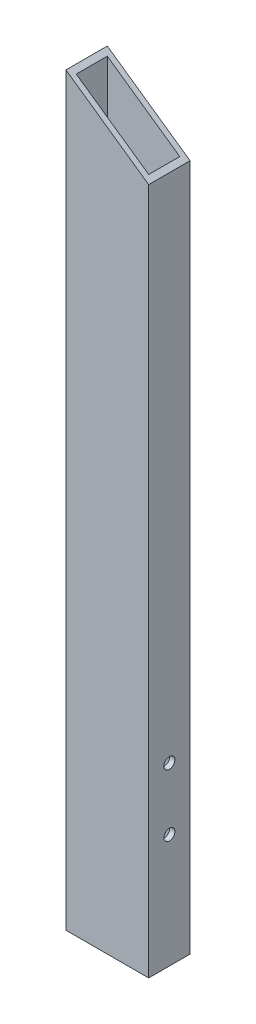
ISO-10303-21;
HEADER;
FILE_DESCRIPTION(('STEP AP214'),'2;1');
FILE_NAME('part.step','',(''),(''),'','','');
FILE_SCHEMA(('AUTOMOTIVE_DESIGN { 1 0 10303 214 1 1 1 1 }'));
ENDSEC;
DATA;
#1=APPLICATION_CONTEXT('core data for automotive mechanical design processes');
#2=APPLICATION_PROTOCOL_DEFINITION('international standard','automotive_design',2000,#1);
#3=PRODUCT_CONTEXT('',#1,'mechanical');
#4=PRODUCT('Part','Part','',(#3));
#5=PRODUCT_RELATED_PRODUCT_CATEGORY('part','',(#4));
#6=PRODUCT_DEFINITION_FORMATION('','',#4);
#7=PRODUCT_DEFINITION_CONTEXT('part definition',#1,'design');
#8=PRODUCT_DEFINITION('design','',#6,#7);
#9=PRODUCT_DEFINITION_SHAPE('','',#8);
#10=(LENGTH_UNIT() NAMED_UNIT(*) SI_UNIT(.MILLI.,.METRE.));
#11=(NAMED_UNIT(*) PLANE_ANGLE_UNIT() SI_UNIT($,.RADIAN.));
#12=(NAMED_UNIT(*) SI_UNIT($,.STERADIAN.) SOLID_ANGLE_UNIT());
#13=UNCERTAINTY_MEASURE_WITH_UNIT(LENGTH_MEASURE(1.E-05),#10,'distance_accuracy_value','');
#14=(GEOMETRIC_REPRESENTATION_CONTEXT(3) GLOBAL_UNCERTAINTY_ASSIGNED_CONTEXT((#13)) GLOBAL_UNIT_ASSIGNED_CONTEXT((#10,
#11,#12)) REPRESENTATION_CONTEXT('',''));
#15=CARTESIAN_POINT('',(0.,0.,0.));
#16=DIRECTION('',(0.,0.,1.));
#17=DIRECTION('',(1.,0.,0.));
#18=AXIS2_PLACEMENT_3D('',#15,#16,#17);
#19=CARTESIAN_POINT('',(476.298045993007,69.85,-8.9078572836938));
#20=DIRECTION('',(-1.,0.,0.));
#21=DIRECTION('',(0.,1.,0.));
#22=AXIS2_PLACEMENT_3D('',#19,#20,#21);
#23=CYLINDRICAL_SURFACE('',#22,3.3782);
#24=CARTESIAN_POINT('',(18.7587744536942,69.85,-8.90785728369348));
#25=DIRECTION('',(-1.,0.,0.));
#26=DIRECTION('',(0.,1.,0.));
#27=AXIS2_PLACEMENT_3D('',#24,#25,#26);
#28=CIRCLE('',#27,3.3782);
#29=CARTESIAN_POINT('',(18.7587744536942,73.2282,-8.90785728369348));
#30=VERTEX_POINT('',#29);
#31=EDGE_CURVE('E210',#30,#30,#28,.T.);
#32=ORIENTED_EDGE('',*,*,#31,.F.);
#33=EDGE_LOOP('',(#32));
#34=FACE_BOUND('',#33,.T.);
#35=CARTESIAN_POINT('',(15.5837744536942,69.85,-8.90785728369348));
#36=DIRECTION('',(1.,0.,0.));
#37=DIRECTION('',(0.,1.,0.));
#38=AXIS2_PLACEMENT_3D('',#35,#36,#37);
#39=CIRCLE('',#38,3.3782);
#40=CARTESIAN_POINT('',(15.5837744536942,73.2282,-8.90785728369348));
#41=VERTEX_POINT('',#40);
#42=EDGE_CURVE('E26',#41,#41,#39,.T.);
#43=ORIENTED_EDGE('',*,*,#42,.F.);
#44=EDGE_LOOP('',(#43));
#45=FACE_BOUND('',#44,.T.);
#46=ADVANCED_FACE('F16',(#34,#45),#23,.F.);
#47=CARTESIAN_POINT('',(476.298045993007,107.95,-8.9078572836938));
#48=DIRECTION('',(-1.,0.,0.));
#49=DIRECTION('',(0.,1.,0.));
#50=AXIS2_PLACEMENT_3D('',#47,#48,#49);
#51=CYLINDRICAL_SURFACE('',#50,3.3782);
#52=CARTESIAN_POINT('',(18.7587744536942,107.95,-8.90785728369348));
#53=DIRECTION('',(-1.,0.,0.));
#54=DIRECTION('',(0.,1.,0.));
#55=AXIS2_PLACEMENT_3D('',#52,#53,#54);
#56=CIRCLE('',#55,3.3782);
#57=CARTESIAN_POINT('',(18.7587744536942,111.3282,-8.90785728369348));
#58=VERTEX_POINT('',#57);
#59=EDGE_CURVE('E153',#58,#58,#56,.T.);
#60=ORIENTED_EDGE('',*,*,#59,.F.);
#61=EDGE_LOOP('',(#60));
#62=FACE_BOUND('',#61,.T.);
#63=CARTESIAN_POINT('',(15.5837744536942,107.95,-8.90785728369348));
#64=DIRECTION('',(1.,0.,0.));
#65=DIRECTION('',(0.,1.,0.));
#66=AXIS2_PLACEMENT_3D('',#63,#64,#65);
#67=CIRCLE('',#66,3.3782);
#68=CARTESIAN_POINT('',(15.5837744536942,111.3282,-8.90785728369348));
#69=VERTEX_POINT('',#68);
#70=EDGE_CURVE('E220',#69,#69,#67,.T.);
#71=ORIENTED_EDGE('',*,*,#70,.F.);
#72=EDGE_LOOP('',(#71));
#73=FACE_BOUND('',#72,.T.);
#74=ADVANCED_FACE('F178',(#62,#73),#51,.F.);
#75=CARTESIAN_POINT('',(428.673045993007,69.85,-8.90785728369361));
#76=DIRECTION('',(-1.,0.,0.));
#77=DIRECTION('',(0.,1.,0.));
#78=AXIS2_PLACEMENT_3D('',#75,#76,#77);
#79=CYLINDRICAL_SURFACE('',#78,3.3782);
#80=CARTESIAN_POINT('',(-28.8662255463058,69.85,-8.90785728369345));
#81=DIRECTION('',(-1.,0.,0.));
#82=DIRECTION('',(0.,1.,0.));
#83=AXIS2_PLACEMENT_3D('',#80,#81,#82);
#84=CIRCLE('',#83,3.3782);
#85=CARTESIAN_POINT('',(-28.8662255463058,73.2282,-8.90785728369345));
#86=VERTEX_POINT('',#85);
#87=EDGE_CURVE('E161',#86,#86,#84,.T.);
#88=ORIENTED_EDGE('',*,*,#87,.F.);
#89=EDGE_LOOP('',(#88));
#90=FACE_BOUND('',#89,.T.);
#91=CARTESIAN_POINT('',(-32.0412255463059,69.85,-8.90785728369344));
#92=DIRECTION('',(1.,0.,0.));
#93=DIRECTION('',(0.,1.,0.));
#94=AXIS2_PLACEMENT_3D('',#91,#92,#93);
#95=CIRCLE('',#94,3.3782);
#96=CARTESIAN_POINT('',(-32.0412255463059,73.2282,-8.90785728369344));
#97=VERTEX_POINT('',#96);
#98=EDGE_CURVE('E122',#97,#97,#95,.T.);
#99=ORIENTED_EDGE('',*,*,#98,.F.);
#100=EDGE_LOOP('',(#99));
#101=FACE_BOUND('',#100,.T.);
#102=ADVANCED_FACE('F184',(#90,#101),#79,.F.);
#103=CARTESIAN_POINT('',(428.673045993007,107.95,-8.90785728369361));
#104=DIRECTION('',(-1.,0.,0.));
#105=DIRECTION('',(0.,1.,0.));
#106=AXIS2_PLACEMENT_3D('',#103,#104,#105);
#107=CYLINDRICAL_SURFACE('',#106,3.3782);
#108=CARTESIAN_POINT('',(-28.8662255463058,107.95,-8.90785728369345));
#109=DIRECTION('',(-1.,0.,0.));
#110=DIRECTION('',(0.,1.,0.));
#111=AXIS2_PLACEMENT_3D('',#108,#109,#110);
#112=CIRCLE('',#111,3.3782);
#113=CARTESIAN_POINT('',(-28.8662255463058,111.3282,-8.90785728369345));
#114=VERTEX_POINT('',#113);
#115=EDGE_CURVE('E141',#114,#114,#112,.T.);
#116=ORIENTED_EDGE('',*,*,#115,.F.);
#117=EDGE_LOOP('',(#116));
#118=FACE_BOUND('',#117,.T.);
#119=CARTESIAN_POINT('',(-32.0412255463059,107.95,-8.90785728369344));
#120=DIRECTION('',(1.,0.,0.));
#121=DIRECTION('',(0.,1.,0.));
#122=AXIS2_PLACEMENT_3D('',#119,#120,#121);
#123=CIRCLE('',#122,3.3782);
#124=CARTESIAN_POINT('',(-32.0412255463059,111.3282,-8.90785728369344));
#125=VERTEX_POINT('',#124);
#126=EDGE_CURVE('E115',#125,#125,#123,.T.);
#127=ORIENTED_EDGE('',*,*,#126,.F.);
#128=EDGE_LOOP('',(#127));
#129=FACE_BOUND('',#128,.T.);
#130=ADVANCED_FACE('F192',(#118,#129),#107,.F.);
#131=CARTESIAN_POINT('',(18.7587744536942,421.629457058947,3.79214271630647));
#132=DIRECTION('',(-0.573576436351046,-0.819152044288992,0.));
#133=DIRECTION('',(0.819152044288992,-0.573576436351046,0.));
#134=AXIS2_PLACEMENT_3D('',#131,#132,#133);
#135=PLANE('',#134);
#136=DIRECTION('',(0.,0.,1.));
#137=VECTOR('',#136,1.);
#138=CARTESIAN_POINT('',(-28.8662255463058,454.976841066184,-7.32035728369349));
#139=LINE('',#138,#137);
#140=CARTESIAN_POINT('',(-28.8662255463058,454.976841066184,-18.4328572836935));
#141=VERTEX_POINT('',#140);
#142=CARTESIAN_POINT('',(-28.8662255463058,454.976841066184,0.617142716306469));
#143=VERTEX_POINT('',#142);
#144=EDGE_CURVE('E35',#141,#143,#139,.T.);
#145=ORIENTED_EDGE('',*,*,#144,.F.);
#146=DIRECTION('',(-0.819152044288992,0.573576436351046,0.));
#147=VECTOR('',#146,1.);
#148=CARTESIAN_POINT('',(116.744068340995,353.019415645365,-18.4328572836936));
#149=LINE('',#148,#147);
#150=CARTESIAN_POINT('',(15.5837744536942,423.852615992763,-18.4328572836935));
#151=VERTEX_POINT('',#150);
#152=EDGE_CURVE('E136',#151,#141,#149,.T.);
#153=ORIENTED_EDGE('',*,*,#152,.F.);
#154=DIRECTION('',(0.,0.,-1.));
#155=VECTOR('',#154,1.);
#156=CARTESIAN_POINT('',(15.5837744536942,423.852615992763,2.20464271630657));
#157=LINE('',#156,#155);
#158=CARTESIAN_POINT('',(15.5837744536942,423.852615992763,0.617142716306464));
#159=VERTEX_POINT('',#158);
#160=EDGE_CURVE('E135',#159,#151,#157,.T.);
#161=ORIENTED_EDGE('',*,*,#160,.F.);
#162=DIRECTION('',(0.819152044288992,-0.573576436351046,0.));
#163=VECTOR('',#162,1.);
#164=CARTESIAN_POINT('',(101.830869498288,363.461749893849,0.617142716306453));
#165=LINE('',#164,#163);
#166=EDGE_CURVE('E121',#143,#159,#165,.T.);
#167=ORIENTED_EDGE('',*,*,#166,.F.);
#168=EDGE_LOOP('',(#145,#153,#161,#167));
#169=FACE_BOUND('',#168,.T.);
#170=DIRECTION('',(-0.819152044288992,0.573576436351046,0.));
#171=VECTOR('',#170,1.);
#172=CARTESIAN_POINT('',(100.765641009523,364.207630911598,3.79214271630647));
#173=LINE('',#172,#171);
#174=CARTESIAN_POINT('',(18.7587744536942,421.629457058947,3.79214271630647));
#175=VERTEX_POINT('',#174);
#176=CARTESIAN_POINT('',(-32.0412255463058,457.2,3.79214271630647));
#177=VERTEX_POINT('',#176);
#178=EDGE_CURVE('E112',#175,#177,#173,.T.);
#179=ORIENTED_EDGE('',*,*,#178,.F.);
#180=DIRECTION('',(0.,0.,1.));
#181=VECTOR('',#180,1.);
#182=CARTESIAN_POINT('',(18.7587744536942,421.629457058947,3.79214271630653));
#183=LINE('',#182,#181);
#184=CARTESIAN_POINT('',(18.7587744536942,421.629457058947,-21.6078572836935));
#185=VERTEX_POINT('',#184);
#186=EDGE_CURVE('E111',#185,#175,#183,.T.);
#187=ORIENTED_EDGE('',*,*,#186,.F.);
#188=DIRECTION('',(0.819152044288992,-0.573576436351046,0.));
#189=VECTOR('',#188,1.);
#190=CARTESIAN_POINT('',(117.809296829759,352.273534627617,-21.6078572836935));
#191=LINE('',#190,#189);
#192=CARTESIAN_POINT('',(-32.0412255463058,457.2,-21.6078572836935));
#193=VERTEX_POINT('',#192);
#194=EDGE_CURVE('E98',#193,#185,#191,.T.);
#195=ORIENTED_EDGE('',*,*,#194,.F.);
#196=DIRECTION('',(0.,0.,1.));
#197=VECTOR('',#196,1.);
#198=CARTESIAN_POINT('',(-32.0412255463058,457.2,3.79214271630647));
#199=LINE('',#198,#197);
#200=EDGE_CURVE('E11',#193,#177,#199,.T.);
#201=ORIENTED_EDGE('',*,*,#200,.T.);
#202=EDGE_LOOP('',(#179,#187,#195,#201));
#203=FACE_BOUND('',#202,.T.);
#204=ADVANCED_FACE('F156',(#169,#203),#135,.F.);
#205=CARTESIAN_POINT('',(15.5837744536942,0.,0.617142716306464));
#206=DIRECTION('',(1.,0.,0.));
#207=DIRECTION('',(0.,0.,-1.));
#208=AXIS2_PLACEMENT_3D('',#205,#206,#207);
#209=PLANE('',#208);
#210=ORIENTED_EDGE('',*,*,#42,.T.);
#211=EDGE_LOOP('',(#210));
#212=FACE_BOUND('',#211,.T.);
#213=ORIENTED_EDGE('',*,*,#70,.T.);
#214=EDGE_LOOP('',(#213));
#215=FACE_BOUND('',#214,.T.);
#216=ORIENTED_EDGE('',*,*,#160,.T.);
#217=DIRECTION('',(0.,1.,0.));
#218=VECTOR('',#217,1.);
#219=CARTESIAN_POINT('',(15.5837744536942,0.,-18.4328572836935));
#220=LINE('',#219,#218);
#221=CARTESIAN_POINT('',(15.5837744536942,0.,-18.4328572836935));
#222=VERTEX_POINT('',#221);
#223=EDGE_CURVE('E131',#222,#151,#220,.T.);
#224=ORIENTED_EDGE('',*,*,#223,.F.);
#225=DIRECTION('',(0.,0.,-1.));
#226=VECTOR('',#225,1.);
#227=CARTESIAN_POINT('',(15.5837744536942,0.,-4.14535728369355));
#228=LINE('',#227,#226);
#229=CARTESIAN_POINT('',(15.5837744536942,0.,0.617142716306464));
#230=VERTEX_POINT('',#229);
#231=EDGE_CURVE('E125',#230,#222,#228,.T.);
#232=ORIENTED_EDGE('',*,*,#231,.F.);
#233=DIRECTION('',(0.,1.,0.));
#234=VECTOR('',#233,1.);
#235=CARTESIAN_POINT('',(15.5837744536942,0.,0.617142716306464));
#236=LINE('',#235,#234);
#237=EDGE_CURVE('E132',#230,#159,#236,.T.);
#238=ORIENTED_EDGE('',*,*,#237,.T.);
#239=EDGE_LOOP('',(#216,#224,#232,#238));
#240=FACE_BOUND('',#239,.T.);
#241=ADVANCED_FACE('F199',(#212,#215,#240),#209,.F.);
#242=CARTESIAN_POINT('',(15.5837744536942,0.,-18.4328572836935));
#243=DIRECTION('',(0.,0.,-1.));
#244=DIRECTION('',(-1.,0.,0.));
#245=AXIS2_PLACEMENT_3D('',#242,#243,#244);
#246=PLANE('',#245);
#247=ORIENTED_EDGE('',*,*,#152,.T.);
#248=DIRECTION('',(0.,1.,0.));
#249=VECTOR('',#248,1.);
#250=CARTESIAN_POINT('',(-28.8662255463058,0.,-18.4328572836935));
#251=LINE('',#250,#249);
#252=CARTESIAN_POINT('',(-28.8662255463058,0.,-18.4328572836935));
#253=VERTEX_POINT('',#252);
#254=EDGE_CURVE('E137',#253,#141,#251,.T.);
#255=ORIENTED_EDGE('',*,*,#254,.F.);
#256=DIRECTION('',(-1.,0.,0.));
#257=VECTOR('',#256,1.);
#258=CARTESIAN_POINT('',(4.47127445369416,0.,-18.4328572836935));
#259=LINE('',#258,#257);
#260=EDGE_CURVE('E117',#222,#253,#259,.T.);
#261=ORIENTED_EDGE('',*,*,#260,.F.);
#262=ORIENTED_EDGE('',*,*,#223,.T.);
#263=EDGE_LOOP('',(#247,#255,#261,#262));
#264=FACE_BOUND('',#263,.T.);
#265=ADVANCED_FACE('F174',(#264),#246,.F.);
#266=CARTESIAN_POINT('',(18.7587744536942,0.,3.79214271630647));
#267=DIRECTION('',(1.,0.,0.));
#268=DIRECTION('',(0.,0.,-1.));
#269=AXIS2_PLACEMENT_3D('',#266,#267,#268);
#270=PLANE('',#269);
#271=ORIENTED_EDGE('',*,*,#31,.T.);
#272=EDGE_LOOP('',(#271));
#273=FACE_BOUND('',#272,.T.);
#274=ORIENTED_EDGE('',*,*,#59,.T.);
#275=EDGE_LOOP('',(#274));
#276=FACE_BOUND('',#275,.T.);
#277=ORIENTED_EDGE('',*,*,#186,.T.);
#278=DIRECTION('',(0.,1.,0.));
#279=VECTOR('',#278,1.);
#280=CARTESIAN_POINT('',(18.7587744536942,0.,3.79214271630647));
#281=LINE('',#280,#279);
#282=CARTESIAN_POINT('',(18.7587744536942,0.,3.79214271630647));
#283=VERTEX_POINT('',#282);
#284=EDGE_CURVE('E108',#283,#175,#281,.T.);
#285=ORIENTED_EDGE('',*,*,#284,.F.);
#286=DIRECTION('',(0.,0.,1.));
#287=VECTOR('',#286,1.);
#288=CARTESIAN_POINT('',(18.7587744536942,0.,-21.6078572836935));
#289=LINE('',#288,#287);
#290=CARTESIAN_POINT('',(18.7587744536942,0.,-21.6078572836935));
#291=VERTEX_POINT('',#290);
#292=EDGE_CURVE('E103',#291,#283,#289,.T.);
#293=ORIENTED_EDGE('',*,*,#292,.F.);
#294=DIRECTION('',(0.,1.,0.));
#295=VECTOR('',#294,1.);
#296=CARTESIAN_POINT('',(18.7587744536942,0.,-21.6078572836935));
#297=LINE('',#296,#295);
#298=EDGE_CURVE('E102',#291,#185,#297,.T.);
#299=ORIENTED_EDGE('',*,*,#298,.T.);
#300=EDGE_LOOP('',(#277,#285,#293,#299));
#301=FACE_BOUND('',#300,.T.);
#302=ADVANCED_FACE('F159',(#273,#276,#301),#270,.T.);
#303=CARTESIAN_POINT('',(-32.0412255463058,0.,3.79214271630647));
#304=DIRECTION('',(0.,0.,1.));
#305=DIRECTION('',(1.,0.,0.));
#306=AXIS2_PLACEMENT_3D('',#303,#304,#305);
#307=PLANE('',#306);
#308=ORIENTED_EDGE('',*,*,#178,.T.);
#309=DIRECTION('',(0.,1.,0.));
#310=VECTOR('',#309,1.);
#311=CARTESIAN_POINT('',(-32.0412255463058,0.,3.79214271630647));
#312=LINE('',#311,#310);
#313=CARTESIAN_POINT('',(-32.0412255463058,0.,3.79214271630647));
#314=VERTEX_POINT('',#313);
#315=EDGE_CURVE('E113',#314,#177,#312,.T.);
#316=ORIENTED_EDGE('',*,*,#315,.F.);
#317=DIRECTION('',(-1.,0.,0.));
#318=VECTOR('',#317,1.);
#319=CARTESIAN_POINT('',(18.7587744536942,0.,3.79214271630647));
#320=LINE('',#319,#318);
#321=EDGE_CURVE('E88',#283,#314,#320,.T.);
#322=ORIENTED_EDGE('',*,*,#321,.F.);
#323=ORIENTED_EDGE('',*,*,#284,.T.);
#324=EDGE_LOOP('',(#308,#316,#322,#323));
#325=FACE_BOUND('',#324,.T.);
#326=ADVANCED_FACE('F162',(#325),#307,.T.);
#327=CARTESIAN_POINT('',(-28.8662255463058,0.,-18.4328572836935));
#328=DIRECTION('',(-1.,0.,0.));
#329=DIRECTION('',(0.,0.,1.));
#330=AXIS2_PLACEMENT_3D('',#327,#328,#329);
#331=PLANE('',#330);
#332=ORIENTED_EDGE('',*,*,#87,.T.);
#333=EDGE_LOOP('',(#332));
#334=FACE_BOUND('',#333,.T.);
#335=ORIENTED_EDGE('',*,*,#115,.T.);
#336=EDGE_LOOP('',(#335));
#337=FACE_BOUND('',#336,.T.);
#338=ORIENTED_EDGE('',*,*,#144,.T.);
#339=DIRECTION('',(0.,1.,0.));
#340=VECTOR('',#339,1.);
#341=CARTESIAN_POINT('',(-28.8662255463058,0.,0.617142716306469));
#342=LINE('',#341,#340);
#343=CARTESIAN_POINT('',(-28.8662255463058,0.,0.617142716306469));
#344=VERTEX_POINT('',#343);
#345=EDGE_CURVE('E118',#344,#143,#342,.T.);
#346=ORIENTED_EDGE('',*,*,#345,.F.);
#347=DIRECTION('',(0.,0.,1.));
#348=VECTOR('',#347,1.);
#349=CARTESIAN_POINT('',(-28.8662255463058,0.,-13.6703572836935));
#350=LINE('',#349,#348);
#351=EDGE_CURVE('E78',#253,#344,#350,.T.);
#352=ORIENTED_EDGE('',*,*,#351,.F.);
#353=ORIENTED_EDGE('',*,*,#254,.T.);
#354=EDGE_LOOP('',(#338,#346,#352,#353));
#355=FACE_BOUND('',#354,.T.);
#356=ADVANCED_FACE('F164',(#334,#337,#355),#331,.F.);
#357=CARTESIAN_POINT('',(-28.8662255463058,0.,0.617142716306469));
#358=DIRECTION('',(0.,0.,1.));
#359=DIRECTION('',(1.,0.,0.));
#360=AXIS2_PLACEMENT_3D('',#357,#358,#359);
#361=PLANE('',#360);
#362=ORIENTED_EDGE('',*,*,#166,.T.);
#363=ORIENTED_EDGE('',*,*,#237,.F.);
#364=DIRECTION('',(1.,0.,0.));
#365=VECTOR('',#364,1.);
#366=CARTESIAN_POINT('',(-17.7537255463058,0.,0.617142716306467));
#367=LINE('',#366,#365);
#368=EDGE_CURVE('E124',#344,#230,#367,.T.);
#369=ORIENTED_EDGE('',*,*,#368,.F.);
#370=ORIENTED_EDGE('',*,*,#345,.T.);
#371=EDGE_LOOP('',(#362,#363,#369,#370));
#372=FACE_BOUND('',#371,.T.);
#373=ADVANCED_FACE('F171',(#372),#361,.F.);
#374=CARTESIAN_POINT('',(-32.0412255463058,0.,-21.6078572836935));
#375=DIRECTION('',(-1.,0.,0.));
#376=DIRECTION('',(0.,0.,1.));
#377=AXIS2_PLACEMENT_3D('',#374,#375,#376);
#378=PLANE('',#377);
#379=ORIENTED_EDGE('',*,*,#98,.T.);
#380=EDGE_LOOP('',(#379));
#381=FACE_BOUND('',#380,.T.);
#382=ORIENTED_EDGE('',*,*,#126,.T.);
#383=EDGE_LOOP('',(#382));
#384=FACE_BOUND('',#383,.T.);
#385=DIRECTION('',(0.,0.,-1.));
#386=VECTOR('',#385,1.);
#387=CARTESIAN_POINT('',(-32.0412255463058,0.,3.79214271630647));
#388=LINE('',#387,#386);
#389=CARTESIAN_POINT('',(-32.0412255463058,0.,-21.6078572836935));
#390=VERTEX_POINT('',#389);
#391=EDGE_CURVE('E84',#314,#390,#388,.T.);
#392=ORIENTED_EDGE('',*,*,#391,.F.);
#393=ORIENTED_EDGE('',*,*,#315,.T.);
#394=ORIENTED_EDGE('',*,*,#200,.F.);
#395=DIRECTION('',(0.,1.,0.));
#396=VECTOR('',#395,1.);
#397=CARTESIAN_POINT('',(-32.0412255463058,0.,-21.6078572836935));
#398=LINE('',#397,#396);
#399=EDGE_CURVE('E95',#390,#193,#398,.T.);
#400=ORIENTED_EDGE('',*,*,#399,.F.);
#401=EDGE_LOOP('',(#392,#393,#394,#400));
#402=FACE_BOUND('',#401,.T.);
#403=ADVANCED_FACE('F96',(#381,#384,#402),#378,.T.);
#404=CARTESIAN_POINT('',(18.7587744536942,0.,-21.6078572836935));
#405=DIRECTION('',(0.,0.,-1.));
#406=DIRECTION('',(-1.,0.,0.));
#407=AXIS2_PLACEMENT_3D('',#404,#405,#406);
#408=PLANE('',#407);
#409=ORIENTED_EDGE('',*,*,#194,.T.);
#410=ORIENTED_EDGE('',*,*,#298,.F.);
#411=DIRECTION('',(1.,0.,0.));
#412=VECTOR('',#411,1.);
#413=CARTESIAN_POINT('',(-32.0412255463058,0.,-21.6078572836935));
#414=LINE('',#413,#412);
#415=EDGE_CURVE('E20',#390,#291,#414,.T.);
#416=ORIENTED_EDGE('',*,*,#415,.F.);
#417=ORIENTED_EDGE('',*,*,#399,.T.);
#418=EDGE_LOOP('',(#409,#410,#416,#417));
#419=FACE_BOUND('',#418,.T.);
#420=ADVANCED_FACE('F100',(#419),#408,.T.);
#421=CARTESIAN_POINT('',(-6.64122554630584,0.,-8.90785728369354));
#422=DIRECTION('',(0.,-1.,0.));
#423=DIRECTION('',(1.,0.,0.));
#424=AXIS2_PLACEMENT_3D('',#421,#422,#423);
#425=PLANE('',#424);
#426=ORIENTED_EDGE('',*,*,#351,.T.);
#427=ORIENTED_EDGE('',*,*,#368,.T.);
#428=ORIENTED_EDGE('',*,*,#231,.T.);
#429=ORIENTED_EDGE('',*,*,#260,.T.);
#430=EDGE_LOOP('',(#426,#427,#428,#429));
#431=FACE_BOUND('',#430,.T.);
#432=ORIENTED_EDGE('',*,*,#321,.T.);
#433=ORIENTED_EDGE('',*,*,#391,.T.);
#434=ORIENTED_EDGE('',*,*,#415,.T.);
#435=ORIENTED_EDGE('',*,*,#292,.T.);
#436=EDGE_LOOP('',(#432,#433,#434,#435));
#437=FACE_BOUND('',#436,.T.);
#438=ADVANCED_FACE('F18',(#431,#437),#425,.T.);
#439=CLOSED_SHELL('',(#46,#74,#102,#130,#204,#241,#265,#302,#326,#356,#373,#403,#420,#438));
#440=MANIFOLD_SOLID_BREP('B1',#439);
#441=ADVANCED_BREP_SHAPE_REPRESENTATION('',(#18,#440),#14);
#442=SHAPE_DEFINITION_REPRESENTATION(#9,#441);
ENDSEC;
END-ISO-10303-21;
